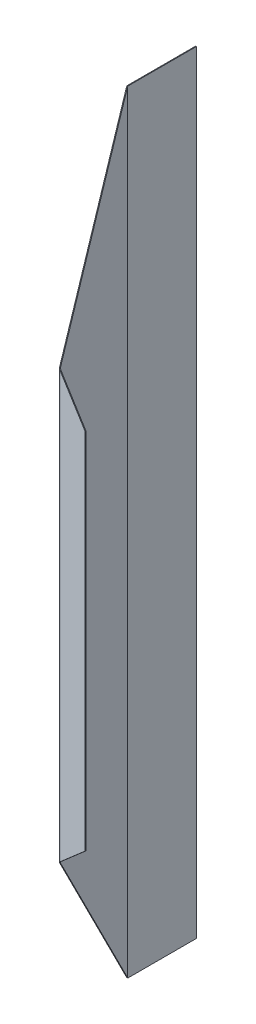
ISO-10303-21;
HEADER;
FILE_DESCRIPTION(('STEP AP214'),'2;1');
FILE_NAME('part.step','',(''),(''),'','','');
FILE_SCHEMA(('AUTOMOTIVE_DESIGN { 1 0 10303 214 1 1 1 1 }'));
ENDSEC;
DATA;
#1=APPLICATION_CONTEXT('core data for automotive mechanical design processes');
#2=APPLICATION_PROTOCOL_DEFINITION('international standard','automotive_design',2000,#1);
#3=PRODUCT_CONTEXT('',#1,'mechanical');
#4=PRODUCT('Part','Part','',(#3));
#5=PRODUCT_RELATED_PRODUCT_CATEGORY('part','',(#4));
#6=PRODUCT_DEFINITION_FORMATION('','',#4);
#7=PRODUCT_DEFINITION_CONTEXT('part definition',#1,'design');
#8=PRODUCT_DEFINITION('design','',#6,#7);
#9=PRODUCT_DEFINITION_SHAPE('','',#8);
#10=(LENGTH_UNIT() NAMED_UNIT(*) SI_UNIT(.MILLI.,.METRE.));
#11=(NAMED_UNIT(*) PLANE_ANGLE_UNIT() SI_UNIT($,.RADIAN.));
#12=(NAMED_UNIT(*) SI_UNIT($,.STERADIAN.) SOLID_ANGLE_UNIT());
#13=UNCERTAINTY_MEASURE_WITH_UNIT(LENGTH_MEASURE(1.E-05),#10,'distance_accuracy_value','');
#14=(GEOMETRIC_REPRESENTATION_CONTEXT(3) GLOBAL_UNCERTAINTY_ASSIGNED_CONTEXT((#13)) GLOBAL_UNIT_ASSIGNED_CONTEXT((#10,
#11,#12)) REPRESENTATION_CONTEXT('',''));
#15=CARTESIAN_POINT('',(0.,0.,0.));
#16=DIRECTION('',(0.,0.,1.));
#17=DIRECTION('',(1.,0.,0.));
#18=AXIS2_PLACEMENT_3D('',#15,#16,#17);
#19=CARTESIAN_POINT('',(41.5605937371392,840.,7.6532480466224));
#20=DIRECTION('',(0.258819045102517,0.,-0.965925826289069));
#21=DIRECTION('',(-0.965925826289069,0.,-0.258819045102517));
#22=AXIS2_PLACEMENT_3D('',#19,#20,#21);
#23=PLANE('',#22);
#24=DIRECTION('',(0.726896130962245,0.658548542068585,0.194771231272638));
#25=VECTOR('',#24,1.);
#26=CARTESIAN_POINT('',(353.700253419294,470.728355092252,91.2908177841798));
#27=LINE('',#26,#25);
#28=CARTESIAN_POINT('',(41.9628570638936,188.302573562308,7.7610341801709));
#29=VERTEX_POINT('',#28);
#30=CARTESIAN_POINT('',(79.7929447639181,222.575625845856,17.8975756289908));
#31=VERTEX_POINT('',#30);
#32=EDGE_CURVE('E217',#29,#31,#27,.T.);
#33=ORIENTED_EDGE('',*,*,#32,.T.);
#34=DIRECTION('',(0.,-1.,0.));
#35=VECTOR('',#34,1.);
#36=CARTESIAN_POINT('',(79.792944763918,840.,17.8975756289908));
#37=LINE('',#36,#35);
#38=CARTESIAN_POINT('',(79.792944763918,617.424374154144,17.8975756289908));
#39=VERTEX_POINT('',#38);
#40=EDGE_CURVE('E11',#39,#31,#37,.T.);
#41=ORIENTED_EDGE('',*,*,#40,.F.);
#42=DIRECTION('',(-0.726896130962245,0.658548542068585,-0.194771231272638));
#43=VECTOR('',#42,1.);
#44=CARTESIAN_POINT('',(-48.4047118963112,733.568038006701,-16.4528829446793));
#45=LINE('',#44,#43);
#46=CARTESIAN_POINT('',(41.9628570638936,651.697426437692,7.7610341801709));
#47=VERTEX_POINT('',#46);
#48=EDGE_CURVE('E225',#39,#47,#45,.T.);
#49=ORIENTED_EDGE('',*,*,#48,.T.);
#50=DIRECTION('',(0.,-1.,0.));
#51=VECTOR('',#50,1.);
#52=CARTESIAN_POINT('',(41.9628570638936,840.,7.7610341801709));
#53=LINE('',#52,#51);
#54=EDGE_CURVE('E177',#47,#29,#53,.T.);
#55=ORIENTED_EDGE('',*,*,#54,.T.);
#56=EDGE_LOOP('',(#33,#41,#49,#55));
#57=FACE_BOUND('',#56,.T.);
#58=ADVANCED_FACE('F34',(#57),#23,.F.);
#59=CARTESIAN_POINT('',(80.,840.,17.1248349679596));
#60=DIRECTION('',(0.965925826289074,0.,0.258819045102499));
#61=DIRECTION('',(0.258819045102499,0.,-0.965925826289074));
#62=AXIS2_PLACEMENT_3D('',#59,#60,#61);
#63=PLANE('',#62);
#64=ORIENTED_EDGE('',*,*,#40,.T.);
#65=DIRECTION('',(-0.258819045102517,0.,0.965925826289069));
#66=VECTOR('',#65,1.);
#67=CARTESIAN_POINT('',(79.7929447639181,222.575625845856,17.8975756289908));
#68=LINE('',#67,#66);
#69=CARTESIAN_POINT('',(80.0000000000001,222.575625845856,17.1248349679596));
#70=VERTEX_POINT('',#69);
#71=EDGE_CURVE('E149',#31,#70,#68,.F.);
#72=ORIENTED_EDGE('',*,*,#71,.T.);
#73=DIRECTION('',(0.,-1.,0.));
#74=VECTOR('',#73,1.);
#75=CARTESIAN_POINT('',(80.,840.,17.1248349679596));
#76=LINE('',#75,#74);
#77=CARTESIAN_POINT('',(80.0000000000001,617.424374154144,17.1248349679596));
#78=VERTEX_POINT('',#77);
#79=EDGE_CURVE('E42',#78,#70,#76,.T.);
#80=ORIENTED_EDGE('',*,*,#79,.F.);
#81=DIRECTION('',(-0.258819045102517,0.,0.965925826289069));
#82=VECTOR('',#81,1.);
#83=CARTESIAN_POINT('',(79.792944763918,617.424374154144,17.8975756289908));
#84=LINE('',#83,#82);
#85=EDGE_CURVE('E208',#39,#78,#84,.F.);
#86=ORIENTED_EDGE('',*,*,#85,.F.);
#87=EDGE_LOOP('',(#64,#72,#80,#86));
#88=FACE_BOUND('',#87,.T.);
#89=ADVANCED_FACE('F207',(#88),#63,.T.);
#90=CARTESIAN_POINT('',(41.7676489732212,840.,6.88050738559115));
#91=DIRECTION('',(0.258819045102517,0.,-0.965925826289069));
#92=DIRECTION('',(-0.96592582628907,0.,-0.258819045102517));
#93=AXIS2_PLACEMENT_3D('',#90,#91,#92);
#94=PLANE('',#93);
#95=ORIENTED_EDGE('',*,*,#79,.T.);
#96=DIRECTION('',(0.726896130962245,0.658548542068585,0.194771231272638));
#97=VECTOR('',#96,1.);
#98=CARTESIAN_POINT('',(353.907308655376,470.728355092252,90.5180771231485));
#99=LINE('',#98,#97);
#100=CARTESIAN_POINT('',(42.1699122999756,188.302573562308,6.98829351913964));
#101=VERTEX_POINT('',#100);
#102=EDGE_CURVE('E202',#101,#70,#99,.T.);
#103=ORIENTED_EDGE('',*,*,#102,.F.);
#104=DIRECTION('',(0.,-1.,0.));
#105=VECTOR('',#104,1.);
#106=CARTESIAN_POINT('',(42.1699122999756,840.,6.98829351913965));
#107=LINE('',#106,#105);
#108=CARTESIAN_POINT('',(42.1699122999756,651.697426437692,6.98829351913965));
#109=VERTEX_POINT('',#108);
#110=EDGE_CURVE('E193',#109,#101,#107,.T.);
#111=ORIENTED_EDGE('',*,*,#110,.F.);
#112=DIRECTION('',(-0.726896130962245,0.658548542068585,-0.194771231272638));
#113=VECTOR('',#112,1.);
#114=CARTESIAN_POINT('',(-48.1976566602291,733.568038006701,-17.2256236057106));
#115=LINE('',#114,#113);
#116=EDGE_CURVE('E203',#78,#109,#115,.T.);
#117=ORIENTED_EDGE('',*,*,#116,.F.);
#118=EDGE_LOOP('',(#95,#103,#111,#117));
#119=FACE_BOUND('',#118,.T.);
#120=ADVANCED_FACE('F200',(#119),#94,.T.);
#121=CARTESIAN_POINT('',(42.3769675360576,840.,6.21555285810838));
#122=DIRECTION('',(0.,-1.,0.));
#123=DIRECTION('',(0.,0.,-1.));
#124=AXIS2_PLACEMENT_3D('',#121,#122,#123);
#125=CYLINDRICAL_SURFACE('',#124,0.8);
#126=ORIENTED_EDGE('',*,*,#110,.T.);
#127=CARTESIAN_POINT('',(42.3769675360576,186.302930806232,6.21555285810838));
#128=DIRECTION('',(-0.325012025135209,0.311422392846851,-0.892963200110202));
#129=DIRECTION('',(-0.106512731436303,-0.950271589196237,-0.292641324505676));
#130=AXIS2_PLACEMENT_3D('',#127,#128,#129);
#131=ELLIPSE('',#130,2.56885830426914,0.8);
#132=CARTESIAN_POINT('',(41.6252134394289,186.302930806232,6.4891689727689));
#133=VERTEX_POINT('',#132);
#134=EDGE_CURVE('E285',#133,#101,#131,.T.);
#135=ORIENTED_EDGE('',*,*,#134,.F.);
#136=DIRECTION('',(0.,-1.,0.));
#137=VECTOR('',#136,1.);
#138=CARTESIAN_POINT('',(41.6252134394289,840.,6.48916897276888));
#139=LINE('',#138,#137);
#140=CARTESIAN_POINT('',(41.6252134394289,653.697069193768,6.48916897276894));
#141=VERTEX_POINT('',#140);
#142=EDGE_CURVE('E190',#141,#133,#139,.T.);
#143=ORIENTED_EDGE('',*,*,#142,.F.);
#144=CARTESIAN_POINT('',(42.3769675360576,653.697069193768,6.21555285810838));
#145=DIRECTION('',(-0.32501202513521,-0.311422392846848,-0.892963200110203));
#146=DIRECTION('',(0.106512731436302,-0.950271589196238,0.292641324505673));
#147=AXIS2_PLACEMENT_3D('',#144,#145,#146);
#148=ELLIPSE('',#147,2.56885830426917,0.8);
#149=EDGE_CURVE('E223',#109,#141,#148,.T.);
#150=ORIENTED_EDGE('',*,*,#149,.F.);
#151=EDGE_LOOP('',(#126,#135,#143,#150));
#152=FACE_BOUND('',#151,.T.);
#153=ADVANCED_FACE('F297',(#152),#125,.F.);
#154=CARTESIAN_POINT('',(0.,840.,-107.87516503204));
#155=DIRECTION('',(0.939692620785908,0.,-0.34202014332567));
#156=DIRECTION('',(-0.34202014332567,0.,-0.939692620785908));
#157=AXIS2_PLACEMENT_3D('',#154,#155,#156);
#158=PLANE('',#157);
#159=ORIENTED_EDGE('',*,*,#142,.T.);
#160=DIRECTION('',(-0.187489312831142,-0.83635901952203,-0.515122653392622));
#161=VECTOR('',#160,1.);
#162=CARTESIAN_POINT('',(-0.138918542133562,0.,-108.256840589696));
#163=LINE('',#162,#161);
#164=CARTESIAN_POINT('',(0.0482459033712412,0.83490983975576,-107.742610501947));
#165=VERTEX_POINT('',#164);
#166=EDGE_CURVE('E148',#133,#165,#163,.T.);
#167=ORIENTED_EDGE('',*,*,#166,.T.);
#168=DIRECTION('',(0.,-1.,0.));
#169=VECTOR('',#168,1.);
#170=CARTESIAN_POINT('',(0.0482459033712802,840.,-107.742610501947));
#171=LINE('',#170,#169);
#172=CARTESIAN_POINT('',(0.0482459033712775,839.165090160244,-107.742610501947));
#173=VERTEX_POINT('',#172);
#174=EDGE_CURVE('E187',#173,#165,#171,.T.);
#175=ORIENTED_EDGE('',*,*,#174,.F.);
#176=DIRECTION('',(0.187489312831142,-0.83635901952203,0.515122653392622));
#177=VECTOR('',#176,1.);
#178=CARTESIAN_POINT('',(-0.138918542133562,840.,-108.256840589696));
#179=LINE('',#178,#177);
#180=EDGE_CURVE('E249',#173,#141,#179,.T.);
#181=ORIENTED_EDGE('',*,*,#180,.T.);
#182=EDGE_LOOP('',(#159,#167,#175,#181));
#183=FACE_BOUND('',#182,.T.);
#184=ADVANCED_FACE('F300',(#183),#158,.T.);
#185=CARTESIAN_POINT('',(0.800000000000002,840.,-108.016226616607));
#186=DIRECTION('',(0.,-1.,0.));
#187=DIRECTION('',(0.,0.,-1.));
#188=AXIS2_PLACEMENT_3D('',#185,#186,#187);
#189=CYLINDRICAL_SURFACE('',#188,0.8);
#190=ORIENTED_EDGE('',*,*,#174,.T.);
#191=CARTESIAN_POINT('',(0.800000000000002,0.834909839755982,-108.016226616607));
#192=DIRECTION('',(-0.286051631728642,0.548182077839243,-0.785920398972588));
#193=DIRECTION('',(-0.187489312831142,-0.83635901952203,-0.515122653392622));
#194=AXIS2_PLACEMENT_3D('',#191,#192,#193);
#195=ELLIPSE('',#194,1.45936912631902,0.8);
#196=CARTESIAN_POINT('',(0.,0.417454919877991,-108.016226616607));
#197=VERTEX_POINT('',#196);
#198=EDGE_CURVE('E157',#197,#165,#195,.T.);
#199=ORIENTED_EDGE('',*,*,#198,.F.);
#200=DIRECTION('',(0.,-1.,0.));
#201=VECTOR('',#200,1.);
#202=CARTESIAN_POINT('',(0.,840.,-108.016226616607));
#203=LINE('',#202,#201);
#204=CARTESIAN_POINT('',(0.,839.582545080122,-108.016226616607));
#205=VERTEX_POINT('',#204);
#206=EDGE_CURVE('E184',#205,#197,#203,.T.);
#207=ORIENTED_EDGE('',*,*,#206,.F.);
#208=CARTESIAN_POINT('',(0.800000000000002,839.165090160244,-108.016226616607));
#209=DIRECTION('',(-0.286051631728642,-0.548182077839243,-0.785920398972588));
#210=DIRECTION('',(0.187489312831142,-0.83635901952203,0.515122653392622));
#211=AXIS2_PLACEMENT_3D('',#208,#209,#210);
#212=ELLIPSE('',#211,1.45936912631902,0.8);
#213=EDGE_CURVE('E234',#173,#205,#212,.T.);
#214=ORIENTED_EDGE('',*,*,#213,.F.);
#215=EDGE_LOOP('',(#190,#199,#207,#214));
#216=FACE_BOUND('',#215,.T.);
#217=ADVANCED_FACE('F310',(#216),#189,.F.);
#218=CARTESIAN_POINT('',(0.,840.,-182.87516503204));
#219=DIRECTION('',(1.,0.,0.));
#220=DIRECTION('',(0.,0.,-1.));
#221=AXIS2_PLACEMENT_3D('',#218,#219,#220);
#222=PLANE('',#221);
#223=ORIENTED_EDGE('',*,*,#206,.T.);
#224=DIRECTION('',(0.,0.820192806896419,0.572087195727517));
#225=VECTOR('',#224,1.);
#226=CARTESIAN_POINT('',(0.,530.092822179721,261.434094032077));
#227=LINE('',#226,#225);
#228=CARTESIAN_POINT('',(0.,0.,-108.30740280402));
#229=VERTEX_POINT('',#228);
#230=EDGE_CURVE('E167',#229,#197,#227,.T.);
#231=ORIENTED_EDGE('',*,*,#230,.F.);
#232=DIRECTION('',(0.,0.,1.));
#233=VECTOR('',#232,1.);
#234=CARTESIAN_POINT('',(0.,0.,-182.87516503204));
#235=LINE('',#234,#233);
#236=CARTESIAN_POINT('',(0.,0.,-182.87516503204));
#237=VERTEX_POINT('',#236);
#238=EDGE_CURVE('E257',#237,#229,#235,.T.);
#239=ORIENTED_EDGE('',*,*,#238,.F.);
#240=DIRECTION('',(0.,-1.,0.));
#241=VECTOR('',#240,1.);
#242=CARTESIAN_POINT('',(0.,840.,-182.87516503204));
#243=LINE('',#242,#241);
#244=CARTESIAN_POINT('',(0.,840.,-182.87516503204));
#245=VERTEX_POINT('',#244);
#246=EDGE_CURVE('E182',#245,#237,#243,.T.);
#247=ORIENTED_EDGE('',*,*,#246,.F.);
#248=DIRECTION('',(0.,0.,1.));
#249=VECTOR('',#248,1.);
#250=CARTESIAN_POINT('',(0.,840.,-182.87516503204));
#251=LINE('',#250,#249);
#252=CARTESIAN_POINT('',(0.,840.,-108.30740280402));
#253=VERTEX_POINT('',#252);
#254=EDGE_CURVE('E260',#245,#253,#251,.T.);
#255=ORIENTED_EDGE('',*,*,#254,.T.);
#256=DIRECTION('',(0.,0.820192806896419,-0.572087195727517));
#257=VECTOR('',#256,1.);
#258=CARTESIAN_POINT('',(0.,874.988819827364,-132.712220364655));
#259=LINE('',#258,#257);
#260=EDGE_CURVE('E57',#205,#253,#259,.T.);
#261=ORIENTED_EDGE('',*,*,#260,.F.);
#262=EDGE_LOOP('',(#223,#231,#239,#247,#255,#261));
#263=FACE_BOUND('',#262,.T.);
#264=ADVANCED_FACE('F313',(#263),#222,.T.);
#265=CARTESIAN_POINT('',(-0.800000000000005,840.,-182.87516503204));
#266=DIRECTION('',(1.,0.,0.));
#267=DIRECTION('',(0.,0.,-1.));
#268=AXIS2_PLACEMENT_3D('',#265,#266,#267);
#269=PLANE('',#268);
#270=DIRECTION('',(0.,0.820192806896419,0.572087195727517));
#271=VECTOR('',#270,1.);
#272=CARTESIAN_POINT('',(-0.799999999999973,530.092822179721,261.434094032077));
#273=LINE('',#272,#271);
#274=CARTESIAN_POINT('',(-0.8,0.,-108.30740280402));
#275=VERTEX_POINT('',#274);
#276=CARTESIAN_POINT('',(-0.799999999999998,0.417454919877991,-108.016226616607));
#277=VERTEX_POINT('',#276);
#278=EDGE_CURVE('E49',#275,#277,#273,.T.);
#279=ORIENTED_EDGE('',*,*,#278,.T.);
#280=DIRECTION('',(0.,-1.,0.));
#281=VECTOR('',#280,1.);
#282=CARTESIAN_POINT('',(-0.799999999999998,840.,-108.016226616607));
#283=LINE('',#282,#281);
#284=CARTESIAN_POINT('',(-0.799999999999998,839.582545080122,-108.016226616607));
#285=VERTEX_POINT('',#284);
#286=EDGE_CURVE('E166',#285,#277,#283,.T.);
#287=ORIENTED_EDGE('',*,*,#286,.F.);
#288=DIRECTION('',(0.,0.820192806896419,-0.572087195727517));
#289=VECTOR('',#288,1.);
#290=CARTESIAN_POINT('',(-0.800000000000002,874.988819827364,-132.712220364655));
#291=LINE('',#290,#289);
#292=CARTESIAN_POINT('',(-0.8,840.,-108.30740280402));
#293=VERTEX_POINT('',#292);
#294=EDGE_CURVE('E240',#285,#293,#291,.T.);
#295=ORIENTED_EDGE('',*,*,#294,.T.);
#296=DIRECTION('',(0.,0.,1.));
#297=VECTOR('',#296,1.);
#298=CARTESIAN_POINT('',(-0.800000000000005,840.,-182.87516503204));
#299=LINE('',#298,#297);
#300=CARTESIAN_POINT('',(-0.800000000000005,840.,-182.87516503204));
#301=VERTEX_POINT('',#300);
#302=EDGE_CURVE('E267',#301,#293,#299,.T.);
#303=ORIENTED_EDGE('',*,*,#302,.F.);
#304=DIRECTION('',(0.,-1.,0.));
#305=VECTOR('',#304,1.);
#306=CARTESIAN_POINT('',(-0.800000000000005,840.,-182.87516503204));
#307=LINE('',#306,#305);
#308=CARTESIAN_POINT('',(-0.800000000000005,0.,-182.87516503204));
#309=VERTEX_POINT('',#308);
#310=EDGE_CURVE('E175',#301,#309,#307,.T.);
#311=ORIENTED_EDGE('',*,*,#310,.T.);
#312=DIRECTION('',(0.,0.,1.));
#313=VECTOR('',#312,1.);
#314=CARTESIAN_POINT('',(-0.800000000000005,0.,-182.87516503204));
#315=LINE('',#314,#313);
#316=EDGE_CURVE('E264',#309,#275,#315,.T.);
#317=ORIENTED_EDGE('',*,*,#316,.T.);
#318=EDGE_LOOP('',(#279,#287,#295,#303,#311,#317));
#319=FACE_BOUND('',#318,.T.);
#320=ADVANCED_FACE('F325',(#319),#269,.F.);
#321=CARTESIAN_POINT('',(0.800000000000002,840.,-108.016226616607));
#322=DIRECTION('',(0.,-1.,0.));
#323=DIRECTION('',(0.,0.,-1.));
#324=AXIS2_PLACEMENT_3D('',#321,#322,#323);
#325=CYLINDRICAL_SURFACE('',#324,1.6);
#326=CARTESIAN_POINT('',(0.800000000000002,0.834909839755982,-108.016226616607));
#327=DIRECTION('',(-0.207441208816461,0.7950701220706,-0.569940037087593));
#328=DIRECTION('',(-0.271929997104545,-0.606517519112714,-0.747121526717094));
#329=AXIS2_PLACEMENT_3D('',#326,#327,#328);
#330=ELLIPSE('',#329,2.0124011148012,1.6);
#331=CARTESIAN_POINT('',(-0.703508193257495,0.83490983975576,-107.468994387286));
#332=VERTEX_POINT('',#331);
#333=EDGE_CURVE('E155',#277,#332,#330,.T.);
#334=ORIENTED_EDGE('',*,*,#333,.T.);
#335=DIRECTION('',(0.,-1.,0.));
#336=VECTOR('',#335,1.);
#337=CARTESIAN_POINT('',(-0.703508193257446,840.,-107.468994387286));
#338=LINE('',#337,#336);
#339=CARTESIAN_POINT('',(-0.703508193257455,839.165090160244,-107.468994387286));
#340=VERTEX_POINT('',#339);
#341=EDGE_CURVE('E164',#340,#332,#338,.T.);
#342=ORIENTED_EDGE('',*,*,#341,.F.);
#343=CARTESIAN_POINT('',(0.800000000000002,839.165090160244,-108.016226616607));
#344=DIRECTION('',(-0.207441208816463,-0.795070122070594,-0.569940037087601));
#345=DIRECTION('',(0.271929997104543,-0.606517519112722,0.747121526717088));
#346=AXIS2_PLACEMENT_3D('',#343,#344,#345);
#347=ELLIPSE('',#346,2.01240111480121,1.6);
#348=EDGE_CURVE('E236',#340,#285,#347,.T.);
#349=ORIENTED_EDGE('',*,*,#348,.T.);
#350=ORIENTED_EDGE('',*,*,#286,.T.);
#351=EDGE_LOOP('',(#334,#342,#349,#350));
#352=FACE_BOUND('',#351,.T.);
#353=ADVANCED_FACE('F162',(#352),#325,.T.);
#354=CARTESIAN_POINT('',(-0.751754096628726,840.,-107.60154891738));
#355=DIRECTION('',(0.939692620785908,0.,-0.34202014332567));
#356=DIRECTION('',(-0.34202014332567,0.,-0.939692620785908));
#357=AXIS2_PLACEMENT_3D('',#354,#355,#356);
#358=PLANE('',#357);
#359=DIRECTION('',(-0.187489312831142,-0.83635901952203,-0.515122653392622));
#360=VECTOR('',#359,1.);
#361=CARTESIAN_POINT('',(-0.890672638762288,0.,-107.983224475035));
#362=LINE('',#361,#360);
#363=CARTESIAN_POINT('',(40.8734593428001,186.302930806232,6.76278508742939));
#364=VERTEX_POINT('',#363);
#365=EDGE_CURVE('E137',#364,#332,#362,.T.);
#366=ORIENTED_EDGE('',*,*,#365,.F.);
#367=DIRECTION('',(0.,-1.,0.));
#368=VECTOR('',#367,1.);
#369=CARTESIAN_POINT('',(40.8734593428001,840.,6.76278508742939));
#370=LINE('',#369,#368);
#371=CARTESIAN_POINT('',(40.8734593428002,653.697069193768,6.76278508742944));
#372=VERTEX_POINT('',#371);
#373=EDGE_CURVE('E173',#372,#364,#370,.T.);
#374=ORIENTED_EDGE('',*,*,#373,.F.);
#375=DIRECTION('',(0.187489312831142,-0.83635901952203,0.515122653392622));
#376=VECTOR('',#375,1.);
#377=CARTESIAN_POINT('',(-0.890672638762288,840.,-107.983224475035));
#378=LINE('',#377,#376);
#379=EDGE_CURVE('E172',#340,#372,#378,.T.);
#380=ORIENTED_EDGE('',*,*,#379,.F.);
#381=ORIENTED_EDGE('',*,*,#341,.T.);
#382=EDGE_LOOP('',(#366,#374,#380,#381));
#383=FACE_BOUND('',#382,.T.);
#384=ADVANCED_FACE('F170',(#383),#358,.F.);
#385=CARTESIAN_POINT('',(42.3769675360576,840.,6.21555285810838));
#386=DIRECTION('',(0.,-1.,0.));
#387=DIRECTION('',(0.,0.,-1.));
#388=AXIS2_PLACEMENT_3D('',#385,#386,#387);
#389=CYLINDRICAL_SURFACE('',#388,1.6);
#390=CARTESIAN_POINT('',(42.3769675360576,186.302930806232,6.21555285810838));
#391=DIRECTION('',(-0.286051631728642,0.548182077839243,-0.785920398972588));
#392=DIRECTION('',(-0.187489312831142,-0.83635901952203,-0.515122653392622));
#393=AXIS2_PLACEMENT_3D('',#390,#391,#392);
#394=ELLIPSE('',#393,2.91873825263804,1.6);
#395=EDGE_CURVE('E282',#364,#29,#394,.T.);
#396=ORIENTED_EDGE('',*,*,#395,.T.);
#397=ORIENTED_EDGE('',*,*,#54,.F.);
#398=CARTESIAN_POINT('',(42.3769675360576,653.697069193768,6.21555285810838));
#399=DIRECTION('',(-0.286051631728642,-0.548182077839243,-0.785920398972588));
#400=DIRECTION('',(0.187489312831142,-0.83635901952203,0.515122653392622));
#401=AXIS2_PLACEMENT_3D('',#398,#399,#400);
#402=ELLIPSE('',#401,2.91873825263804,1.6);
#403=EDGE_CURVE('E221',#47,#372,#402,.T.);
#404=ORIENTED_EDGE('',*,*,#403,.T.);
#405=ORIENTED_EDGE('',*,*,#373,.T.);
#406=EDGE_LOOP('',(#396,#397,#404,#405));
#407=FACE_BOUND('',#406,.T.);
#408=ADVANCED_FACE('F281',(#407),#389,.T.);
#409=CARTESIAN_POINT('',(-0.703508193257446,0.,-107.468994387286));
#410=DIRECTION('',(0.,-1.,0.));
#411=DIRECTION('',(0.,0.,-1.));
#412=AXIS2_PLACEMENT_3D('',#409,#410,#411);
#413=PLANE('',#412);
#414=ORIENTED_EDGE('',*,*,#238,.T.);
#415=DIRECTION('',(1.,0.,0.));
#416=VECTOR('',#415,1.);
#417=CARTESIAN_POINT('',(0.,0.,-108.30740280402));
#418=LINE('',#417,#416);
#419=EDGE_CURVE('E289',#229,#275,#418,.F.);
#420=ORIENTED_EDGE('',*,*,#419,.T.);
#421=ORIENTED_EDGE('',*,*,#316,.F.);
#422=DIRECTION('',(1.,0.,0.));
#423=VECTOR('',#422,1.);
#424=CARTESIAN_POINT('',(-0.800000000000005,0.,-182.87516503204));
#425=LINE('',#424,#423);
#426=EDGE_CURVE('E272',#309,#237,#425,.T.);
#427=ORIENTED_EDGE('',*,*,#426,.T.);
#428=EDGE_LOOP('',(#414,#420,#421,#427));
#429=FACE_BOUND('',#428,.T.);
#430=ADVANCED_FACE('F36',(#429),#413,.T.);
#431=CARTESIAN_POINT('',(42.3769675360576,840.,6.21555285810838));
#432=DIRECTION('',(0.,-1.,0.));
#433=DIRECTION('',(0.,0.,-1.));
#434=AXIS2_PLACEMENT_3D('',#431,#432,#433);
#435=PLANE('',#434);
#436=DIRECTION('',(1.,0.,0.));
#437=VECTOR('',#436,1.);
#438=CARTESIAN_POINT('',(0.,840.,-108.30740280402));
#439=LINE('',#438,#437);
#440=EDGE_CURVE('E245',#253,#293,#439,.F.);
#441=ORIENTED_EDGE('',*,*,#440,.F.);
#442=ORIENTED_EDGE('',*,*,#254,.F.);
#443=DIRECTION('',(1.,0.,0.));
#444=VECTOR('',#443,1.);
#445=CARTESIAN_POINT('',(-0.800000000000005,840.,-182.87516503204));
#446=LINE('',#445,#444);
#447=EDGE_CURVE('E263',#301,#245,#446,.T.);
#448=ORIENTED_EDGE('',*,*,#447,.F.);
#449=ORIENTED_EDGE('',*,*,#302,.T.);
#450=EDGE_LOOP('',(#441,#442,#448,#449));
#451=FACE_BOUND('',#450,.T.);
#452=ADVANCED_FACE('F318',(#451),#435,.F.);
#453=CARTESIAN_POINT('',(-0.800000000000005,840.,-182.87516503204));
#454=DIRECTION('',(0.,0.,-1.));
#455=DIRECTION('',(-1.,0.,0.));
#456=AXIS2_PLACEMENT_3D('',#453,#454,#455);
#457=PLANE('',#456);
#458=ORIENTED_EDGE('',*,*,#426,.F.);
#459=ORIENTED_EDGE('',*,*,#310,.F.);
#460=ORIENTED_EDGE('',*,*,#447,.T.);
#461=ORIENTED_EDGE('',*,*,#246,.T.);
#462=EDGE_LOOP('',(#458,#459,#460,#461));
#463=FACE_BOUND('',#462,.T.);
#464=ADVANCED_FACE('F321',(#463),#457,.T.);
#465=CARTESIAN_POINT('',(-0.890672638762288,840.,-107.983224475035));
#466=DIRECTION('',(0.286051631728642,0.548182077839243,0.785920398972588));
#467=DIRECTION('',(0.187489312831142,-0.83635901952203,0.515122653392622));
#468=AXIS2_PLACEMENT_3D('',#465,#466,#467);
#469=PLANE('',#468);
#470=DIRECTION('',(-0.939692620785908,0.,0.34202014332567));
#471=VECTOR('',#470,1.);
#472=CARTESIAN_POINT('',(-0.703508193257455,839.165090160244,-107.468994387286));
#473=LINE('',#472,#471);
#474=EDGE_CURVE('E254',#340,#173,#473,.F.);
#475=ORIENTED_EDGE('',*,*,#474,.F.);
#476=ORIENTED_EDGE('',*,*,#379,.T.);
#477=DIRECTION('',(-0.939692620785908,0.,0.34202014332567));
#478=VECTOR('',#477,1.);
#479=CARTESIAN_POINT('',(40.8734593428002,653.697069193768,6.76278508742944));
#480=LINE('',#479,#478);
#481=EDGE_CURVE('E252',#372,#141,#480,.F.);
#482=ORIENTED_EDGE('',*,*,#481,.T.);
#483=ORIENTED_EDGE('',*,*,#180,.F.);
#484=EDGE_LOOP('',(#475,#476,#482,#483));
#485=FACE_BOUND('',#484,.T.);
#486=ADVANCED_FACE('F303',(#485),#469,.T.);
#487=CARTESIAN_POINT('',(0.,874.988819827364,-132.712220364655));
#488=DIRECTION('',(0.,-0.572087195727517,-0.820192806896418));
#489=DIRECTION('',(0.,0.820192806896419,-0.572087195727517));
#490=AXIS2_PLACEMENT_3D('',#487,#488,#489);
#491=PLANE('',#490);
#492=ORIENTED_EDGE('',*,*,#260,.T.);
#493=ORIENTED_EDGE('',*,*,#440,.T.);
#494=ORIENTED_EDGE('',*,*,#294,.F.);
#495=DIRECTION('',(1.,0.,0.));
#496=VECTOR('',#495,1.);
#497=CARTESIAN_POINT('',(0.,839.582545080122,-108.016226616607));
#498=LINE('',#497,#496);
#499=EDGE_CURVE('E243',#205,#285,#498,.F.);
#500=ORIENTED_EDGE('',*,*,#499,.F.);
#501=EDGE_LOOP('',(#492,#493,#494,#500));
#502=FACE_BOUND('',#501,.T.);
#503=ADVANCED_FACE('F326',(#502),#491,.F.);
#504=CARTESIAN_POINT('',(1.07361611466054,837.944533628635,-107.264472519978));
#505=CARTESIAN_POINT('',(1.16482148621405,837.944533628635,-107.013887821102));
#506=CARTESIAN_POINT('',(1.25602685776756,837.944533628635,-106.763303122226));
#507=CARTESIAN_POINT('',(1.34723222932107,837.944533628635,-106.51271842335));
#508=CARTESIAN_POINT('',(-0.429892078596914,837.944533628635,-106.717240290657));
#509=CARTESIAN_POINT('',(-0.839856104795887,837.944533628635,-106.284244848674));
#510=CARTESIAN_POINT('',(-1.24982013099486,837.944533628635,-105.851249406691));
#511=CARTESIAN_POINT('',(-1.65978415719383,837.944533628635,-105.418253964708));
#512=CARTESIAN_POINT('',(-0.977124307917987,840.385646691853,-108.220748483915));
#513=CARTESIAN_POINT('',(-1.56949907722398,840.385646691853,-108.288922439684));
#514=CARTESIAN_POINT('',(-2.16187384652998,840.385646691853,-108.357096395453));
#515=CARTESIAN_POINT('',(-2.75424861583598,840.385646691853,-108.425270351223));
#516=CARTESIAN_POINT('',(0.526383885339466,840.385646691853,-108.767980713236));
#517=CARTESIAN_POINT('',(0.435178513785954,840.385646691853,-109.018565412112));
#518=CARTESIAN_POINT('',(0.343973142232442,840.385646691853,-109.269150110988));
#519=CARTESIAN_POINT('',(0.252767770678929,840.385646691853,-109.519734809865));
#520=CARTESIAN_POINT('',(2.02989207859692,840.385646691853,-109.315212942557));
#521=CARTESIAN_POINT('',(2.43985610479589,840.385646691853,-109.74820838454));
#522=CARTESIAN_POINT('',(2.84982013099486,840.385646691853,-110.181203826524));
#523=CARTESIAN_POINT('',(3.25978415719384,840.385646691853,-110.614199268507));
#524=CARTESIAN_POINT('',(2.57712430791799,837.944533628635,-107.8117047493));
#525=CARTESIAN_POINT('',(3.16949907722399,837.944533628635,-107.74353079353));
#526=CARTESIAN_POINT('',(3.76187384652999,837.944533628635,-107.675356837761));
#527=CARTESIAN_POINT('',(4.35424861583598,837.944533628635,-107.607182881992));
#528=CARTESIAN_POINT('',(1.07361611466054,837.944533628635,-107.264472519978));
#529=CARTESIAN_POINT('',(1.16482148621405,837.944533628635,-107.013887821102));
#530=CARTESIAN_POINT('',(1.25602685776756,837.944533628635,-106.763303122226));
#531=CARTESIAN_POINT('',(1.34723222932107,837.944533628635,-106.51271842335));
#532=(BOUNDED_SURFACE() B_SPLINE_SURFACE(3,3,((#504,#505,#506,#507),(#508,#509,#510,#511),(#512,
#513,#514,#515),(#516,#517,#518,#519),(#520,#521,#522,#523),(#524,#525,#526,#527),(#528,#529,
#530,#531)),.UNSPECIFIED.,.T.,.F.,.F.) B_SPLINE_SURFACE_WITH_KNOTS((4,3,4),(4,4),(0.,0.5,1.),
(0.,1.),.UNSPECIFIED.) GEOMETRIC_REPRESENTATION_ITEM() RATIONAL_B_SPLINE_SURFACE(((1.,1.,1.,1.),
(0.333333333333333,0.333333333333333,0.333333333333333,0.333333333333333),(0.333333333333333,
0.333333333333333,0.333333333333333,0.333333333333333),(1.,1.,1.,1.),(0.333333333333333,
0.333333333333333,0.333333333333333,0.333333333333333),(0.333333333333333,0.333333333333333,
0.333333333333333,0.333333333333333),(1.,1.,1.,1.))) REPRESENTATION_ITEM('') SURFACE());
#533=ORIENTED_EDGE('',*,*,#213,.T.);
#534=ORIENTED_EDGE('',*,*,#499,.T.);
#535=ORIENTED_EDGE('',*,*,#348,.F.);
#536=ORIENTED_EDGE('',*,*,#474,.T.);
#537=EDGE_LOOP('',(#533,#534,#535,#536));
#538=FACE_BOUND('',#537,.T.);
#539=ADVANCED_FACE('F307',(#538),#532,.T.);
#540=CARTESIAN_POINT('',(-48.4047118963112,733.568038006701,-16.4528829446793));
#541=DIRECTION('',(-0.63610904464906,-0.75253825001746,-0.170444904811846));
#542=DIRECTION('',(-0.726896130962245,0.658548542068585,-0.194771231272638));
#543=AXIS2_PLACEMENT_3D('',#540,#541,#542);
#544=PLANE('',#543);
#545=DIRECTION('',(-0.258819045102517,0.,0.965925826289069));
#546=VECTOR('',#545,1.);
#547=CARTESIAN_POINT('',(41.9628570638936,651.697426437692,7.7610341801709));
#548=LINE('',#547,#546);
#549=EDGE_CURVE('E231',#47,#109,#548,.F.);
#550=ORIENTED_EDGE('',*,*,#549,.F.);
#551=ORIENTED_EDGE('',*,*,#48,.F.);
#552=ORIENTED_EDGE('',*,*,#85,.T.);
#553=ORIENTED_EDGE('',*,*,#116,.T.);
#554=EDGE_LOOP('',(#550,#551,#552,#553));
#555=FACE_BOUND('',#554,.T.);
#556=ADVANCED_FACE('F333',(#555),#544,.F.);
#557=CARTESIAN_POINT('',(42.6505836507181,651.25595613055,6.96730695473711));
#558=CARTESIAN_POINT('',(42.7417890222716,651.25595613055,7.21789165361335));
#559=CARTESIAN_POINT('',(42.8329943938252,651.25595613055,7.46847635248959));
#560=CARTESIAN_POINT('',(42.9241997653787,651.25595613055,7.71906105136584));
#561=CARTESIAN_POINT('',(41.1470754574607,651.25595613055,7.51453918405818));
#562=CARTESIAN_POINT('',(40.7371114312617,651.25595613055,7.94753462604145));
#563=CARTESIAN_POINT('',(40.3271474050628,651.25595613055,8.38053006802472));
#564=CARTESIAN_POINT('',(39.9171833788638,651.25595613055,8.81352551000798));
#565=CARTESIAN_POINT('',(40.5998432281396,656.138182256985,6.01103099080073));
#566=CARTESIAN_POINT('',(40.0074684588336,656.138182256986,5.94285703503151));
#567=CARTESIAN_POINT('',(39.4150936895276,656.138182256986,5.87468307926229));
#568=CARTESIAN_POINT('',(38.8227189202216,656.138182256985,5.80650912349307));
#569=CARTESIAN_POINT('',(42.1033514213971,656.138182256985,5.46379876147966));
#570=CARTESIAN_POINT('',(42.0121460498435,656.138182256985,5.21321406260341));
#571=CARTESIAN_POINT('',(41.92094067829,656.138182256985,4.96262936372717));
#572=CARTESIAN_POINT('',(41.8297353067365,656.138182256985,4.71204466485093));
#573=CARTESIAN_POINT('',(43.6068596146545,656.138182256985,4.91656653215858));
#574=CARTESIAN_POINT('',(44.0168236408535,656.138182256986,4.48357109017532));
#575=CARTESIAN_POINT('',(44.4267876670525,656.138182256986,4.05057564819205));
#576=CARTESIAN_POINT('',(44.8367516932514,656.138182256985,3.61758020620878));
#577=CARTESIAN_POINT('',(44.1540918439756,651.25595613055,6.42007472541604));
#578=CARTESIAN_POINT('',(44.7464666132816,651.25595613055,6.48824868118526));
#579=CARTESIAN_POINT('',(45.3388413825876,651.25595613055,6.55642263695448));
#580=CARTESIAN_POINT('',(45.9312161518936,651.25595613055,6.62459659272369));
#581=CARTESIAN_POINT('',(42.6505836507181,651.25595613055,6.96730695473711));
#582=CARTESIAN_POINT('',(42.7417890222716,651.25595613055,7.21789165361335));
#583=CARTESIAN_POINT('',(42.8329943938252,651.25595613055,7.46847635248959));
#584=CARTESIAN_POINT('',(42.9241997653787,651.25595613055,7.71906105136584));
#585=(BOUNDED_SURFACE() B_SPLINE_SURFACE(3,3,((#557,#558,#559,#560),(#561,#562,#563,#564),(#565,
#566,#567,#568),(#569,#570,#571,#572),(#573,#574,#575,#576),(#577,#578,#579,#580),(#581,#582,
#583,#584)),.UNSPECIFIED.,.T.,.F.,.F.) B_SPLINE_SURFACE_WITH_KNOTS((4,3,4),(4,4),(0.,0.5,1.),
(0.,1.),.UNSPECIFIED.) GEOMETRIC_REPRESENTATION_ITEM() RATIONAL_B_SPLINE_SURFACE(((1.,1.,1.,1.),
(0.333333333333333,0.333333333333333,0.333333333333333,0.333333333333333),(0.333333333333333,
0.333333333333333,0.333333333333333,0.333333333333333),(1.,1.,1.,1.),(0.333333333333333,
0.333333333333333,0.333333333333333,0.333333333333333),(0.333333333333333,0.333333333333333,
0.333333333333333,0.333333333333333),(1.,1.,1.,1.))) REPRESENTATION_ITEM('') SURFACE());
#586=ORIENTED_EDGE('',*,*,#481,.F.);
#587=ORIENTED_EDGE('',*,*,#403,.F.);
#588=ORIENTED_EDGE('',*,*,#549,.T.);
#589=ORIENTED_EDGE('',*,*,#149,.T.);
#590=EDGE_LOOP('',(#586,#587,#588,#589));
#591=FACE_BOUND('',#590,.T.);
#592=ADVANCED_FACE('F395',(#591),#585,.T.);
#593=CARTESIAN_POINT('',(-0.890672638762288,0.,-107.983224475035));
#594=DIRECTION('',(0.286051631728642,-0.548182077839243,0.785920398972588));
#595=DIRECTION('',(-0.187489312831142,-0.83635901952203,-0.515122653392622));
#596=AXIS2_PLACEMENT_3D('',#593,#594,#595);
#597=PLANE('',#596);
#598=DIRECTION('',(-0.939692620785908,0.,0.34202014332567));
#599=VECTOR('',#598,1.);
#600=CARTESIAN_POINT('',(40.8734593428001,186.302930806232,6.76278508742939));
#601=LINE('',#600,#599);
#602=EDGE_CURVE('E143',#364,#133,#601,.F.);
#603=ORIENTED_EDGE('',*,*,#602,.F.);
#604=ORIENTED_EDGE('',*,*,#365,.T.);
#605=DIRECTION('',(-0.939692620785908,0.,0.34202014332567));
#606=VECTOR('',#605,1.);
#607=CARTESIAN_POINT('',(-0.703508193257492,0.834909839755814,-107.468994387286));
#608=LINE('',#607,#606);
#609=EDGE_CURVE('E140',#332,#165,#608,.F.);
#610=ORIENTED_EDGE('',*,*,#609,.T.);
#611=ORIENTED_EDGE('',*,*,#166,.F.);
#612=EDGE_LOOP('',(#603,#604,#610,#611));
#613=FACE_BOUND('',#612,.T.);
#614=ADVANCED_FACE('F139',(#613),#597,.T.);
#615=CARTESIAN_POINT('',(353.700253419294,470.728355092252,91.2908177841798));
#616=DIRECTION('',(-0.63610904464906,0.75253825001746,-0.170444904811846));
#617=DIRECTION('',(0.726896130962245,0.658548542068585,0.194771231272638));
#618=AXIS2_PLACEMENT_3D('',#615,#616,#617);
#619=PLANE('',#618);
#620=ORIENTED_EDGE('',*,*,#71,.F.);
#621=ORIENTED_EDGE('',*,*,#32,.F.);
#622=DIRECTION('',(-0.258819045102517,0.,0.965925826289069));
#623=VECTOR('',#622,1.);
#624=CARTESIAN_POINT('',(41.9628570638936,188.302573562308,7.7610341801709));
#625=LINE('',#624,#623);
#626=EDGE_CURVE('E212',#29,#101,#625,.F.);
#627=ORIENTED_EDGE('',*,*,#626,.T.);
#628=ORIENTED_EDGE('',*,*,#102,.T.);
#629=EDGE_LOOP('',(#620,#621,#627,#628));
#630=FACE_BOUND('',#629,.T.);
#631=ADVANCED_FACE('F292',(#630),#619,.F.);
#632=CARTESIAN_POINT('',(42.1033514213971,183.861817743015,5.46379876147966));
#633=CARTESIAN_POINT('',(42.0121460498435,183.861817743015,5.21321406260341));
#634=CARTESIAN_POINT('',(41.92094067829,183.861817743015,4.96262936372717));
#635=CARTESIAN_POINT('',(41.8297353067365,183.861817743015,4.71204466485093));
#636=CARTESIAN_POINT('',(40.5998432281396,183.861817743015,6.01103099080073));
#637=CARTESIAN_POINT('',(40.0074684588336,183.861817743015,5.94285703503151));
#638=CARTESIAN_POINT('',(39.4150936895276,183.861817743015,5.87468307926229));
#639=CARTESIAN_POINT('',(38.8227189202216,183.861817743015,5.80650912349307));
#640=CARTESIAN_POINT('',(41.1470754574607,188.74404386945,7.51453918405818));
#641=CARTESIAN_POINT('',(40.7371114312617,188.74404386945,7.94753462604145));
#642=CARTESIAN_POINT('',(40.3271474050628,188.74404386945,8.38053006802472));
#643=CARTESIAN_POINT('',(39.9171833788638,188.74404386945,8.81352551000798));
#644=CARTESIAN_POINT('',(42.6505836507181,188.74404386945,6.96730695473711));
#645=CARTESIAN_POINT('',(42.7417890222716,188.74404386945,7.21789165361335));
#646=CARTESIAN_POINT('',(42.8329943938252,188.74404386945,7.46847635248959));
#647=CARTESIAN_POINT('',(42.9241997653787,188.74404386945,7.71906105136584));
#648=CARTESIAN_POINT('',(44.1540918439756,188.74404386945,6.42007472541604));
#649=CARTESIAN_POINT('',(44.7464666132816,188.74404386945,6.48824868118526));
#650=CARTESIAN_POINT('',(45.3388413825876,188.74404386945,6.55642263695448));
#651=CARTESIAN_POINT('',(45.9312161518936,188.74404386945,6.62459659272369));
#652=CARTESIAN_POINT('',(43.6068596146545,183.861817743015,4.91656653215858));
#653=CARTESIAN_POINT('',(44.0168236408535,183.861817743015,4.48357109017532));
#654=CARTESIAN_POINT('',(44.4267876670525,183.861817743015,4.05057564819205));
#655=CARTESIAN_POINT('',(44.8367516932514,183.861817743015,3.61758020620878));
#656=CARTESIAN_POINT('',(42.1033514213971,183.861817743015,5.46379876147966));
#657=CARTESIAN_POINT('',(42.0121460498435,183.861817743015,5.21321406260341));
#658=CARTESIAN_POINT('',(41.92094067829,183.861817743015,4.96262936372717));
#659=CARTESIAN_POINT('',(41.8297353067365,183.861817743015,4.71204466485093));
#660=(BOUNDED_SURFACE() B_SPLINE_SURFACE(3,3,((#632,#633,#634,#635),(#636,#637,#638,#639),(#640,
#641,#642,#643),(#644,#645,#646,#647),(#648,#649,#650,#651),(#652,#653,#654,#655),(#656,#657,
#658,#659)),.UNSPECIFIED.,.T.,.F.,.F.) B_SPLINE_SURFACE_WITH_KNOTS((4,3,4),(4,4),(0.,0.5,1.),
(0.,1.),.UNSPECIFIED.) GEOMETRIC_REPRESENTATION_ITEM() RATIONAL_B_SPLINE_SURFACE(((1.,1.,1.,1.),
(0.333333333333333,0.333333333333333,0.333333333333333,0.333333333333333),(0.333333333333333,
0.333333333333333,0.333333333333333,0.333333333333333),(1.,1.,1.,1.),(0.333333333333333,
0.333333333333333,0.333333333333333,0.333333333333333),(0.333333333333333,0.333333333333333,
0.333333333333333,0.333333333333333),(1.,1.,1.,1.))) REPRESENTATION_ITEM('') SURFACE());
#661=ORIENTED_EDGE('',*,*,#626,.F.);
#662=ORIENTED_EDGE('',*,*,#395,.F.);
#663=ORIENTED_EDGE('',*,*,#602,.T.);
#664=ORIENTED_EDGE('',*,*,#134,.T.);
#665=EDGE_LOOP('',(#661,#662,#663,#664));
#666=FACE_BOUND('',#665,.T.);
#667=ADVANCED_FACE('F293',(#666),#660,.T.);
#668=CARTESIAN_POINT('',(0.,530.092822179721,261.434094032077));
#669=DIRECTION('',(0.,0.572087195727517,-0.820192806896418));
#670=DIRECTION('',(0.,0.820192806896419,0.572087195727517));
#671=AXIS2_PLACEMENT_3D('',#668,#669,#670);
#672=PLANE('',#671);
#673=ORIENTED_EDGE('',*,*,#230,.T.);
#674=DIRECTION('',(1.,0.,0.));
#675=VECTOR('',#674,1.);
#676=CARTESIAN_POINT('',(0.,0.417454919877991,-108.016226616607));
#677=LINE('',#676,#675);
#678=EDGE_CURVE('E286',#197,#277,#677,.F.);
#679=ORIENTED_EDGE('',*,*,#678,.T.);
#680=ORIENTED_EDGE('',*,*,#278,.F.);
#681=ORIENTED_EDGE('',*,*,#419,.F.);
#682=EDGE_LOOP('',(#673,#679,#680,#681));
#683=FACE_BOUND('',#682,.T.);
#684=ADVANCED_FACE('F372',(#683),#672,.F.);
#685=CARTESIAN_POINT('',(0.526383885339466,-0.385646691852913,-108.767980713236));
#686=CARTESIAN_POINT('',(0.435178513785954,-0.38564669185291,-109.018565412112));
#687=CARTESIAN_POINT('',(0.343973142232442,-0.385646691852906,-109.269150110988));
#688=CARTESIAN_POINT('',(0.25276777067893,-0.385646691852902,-109.519734809865));
#689=CARTESIAN_POINT('',(-0.977124307917986,-0.385646691852913,-108.220748483915));
#690=CARTESIAN_POINT('',(-1.56949907722398,-0.38564669185291,-108.288922439684));
#691=CARTESIAN_POINT('',(-2.16187384652998,-0.385646691852906,-108.357096395453));
#692=CARTESIAN_POINT('',(-2.75424861583598,-0.385646691852902,-108.425270351223));
#693=CARTESIAN_POINT('',(-0.429892078596914,2.05546637136488,-106.717240290657));
#694=CARTESIAN_POINT('',(-0.839856104795887,2.05546637136487,-106.284244848674));
#695=CARTESIAN_POINT('',(-1.24982013099486,2.05546637136487,-105.851249406691));
#696=CARTESIAN_POINT('',(-1.65978415719383,2.05546637136486,-105.418253964708));
#697=CARTESIAN_POINT('',(1.07361611466054,2.05546637136488,-107.264472519978));
#698=CARTESIAN_POINT('',(1.16482148621405,2.05546637136487,-107.013887821102));
#699=CARTESIAN_POINT('',(1.25602685776756,2.05546637136487,-106.763303122226));
#700=CARTESIAN_POINT('',(1.34723222932107,2.05546637136487,-106.51271842335));
#701=CARTESIAN_POINT('',(2.57712430791799,2.05546637136488,-107.8117047493));
#702=CARTESIAN_POINT('',(3.16949907722399,2.05546637136487,-107.74353079353));
#703=CARTESIAN_POINT('',(3.76187384652998,2.05546637136487,-107.675356837761));
#704=CARTESIAN_POINT('',(4.35424861583598,2.05546637136487,-107.607182881992));
#705=CARTESIAN_POINT('',(2.02989207859692,-0.385646691852913,-109.315212942557));
#706=CARTESIAN_POINT('',(2.43985610479589,-0.38564669185291,-109.74820838454));
#707=CARTESIAN_POINT('',(2.84982013099486,-0.385646691852906,-110.181203826524));
#708=CARTESIAN_POINT('',(3.25978415719383,-0.385646691852902,-110.614199268507));
#709=CARTESIAN_POINT('',(0.526383885339466,-0.385646691852913,-108.767980713236));
#710=CARTESIAN_POINT('',(0.435178513785954,-0.38564669185291,-109.018565412112));
#711=CARTESIAN_POINT('',(0.343973142232442,-0.385646691852906,-109.269150110988));
#712=CARTESIAN_POINT('',(0.25276777067893,-0.385646691852902,-109.519734809865));
#713=(BOUNDED_SURFACE() B_SPLINE_SURFACE(3,3,((#685,#686,#687,#688),(#689,#690,#691,#692),(#693,
#694,#695,#696),(#697,#698,#699,#700),(#701,#702,#703,#704),(#705,#706,#707,#708),(#709,#710,
#711,#712)),.UNSPECIFIED.,.T.,.F.,.F.) B_SPLINE_SURFACE_WITH_KNOTS((4,3,4),(4,4),(0.,0.5,1.),
(0.,1.),.UNSPECIFIED.) GEOMETRIC_REPRESENTATION_ITEM() RATIONAL_B_SPLINE_SURFACE(((1.,1.,1.,1.),
(0.333333333333333,0.333333333333333,0.333333333333333,0.333333333333333),(0.333333333333333,
0.333333333333333,0.333333333333333,0.333333333333333),(1.,1.,1.,1.),(0.333333333333333,
0.333333333333333,0.333333333333333,0.333333333333333),(0.333333333333333,0.333333333333333,
0.333333333333333,0.333333333333333),(1.,1.,1.,1.))) REPRESENTATION_ITEM('') SURFACE());
#714=ORIENTED_EDGE('',*,*,#198,.T.);
#715=ORIENTED_EDGE('',*,*,#609,.F.);
#716=ORIENTED_EDGE('',*,*,#333,.F.);
#717=ORIENTED_EDGE('',*,*,#678,.F.);
#718=EDGE_LOOP('',(#714,#715,#716,#717));
#719=FACE_BOUND('',#718,.T.);
#720=ADVANCED_FACE('F153',(#719),#713,.T.);
#721=CLOSED_SHELL('',(#58,#89,#120,#153,#184,#217,#264,#320,#353,#384,#408,#430,#452,#464,#486,
#503,#539,#556,#592,#614,#631,#667,#684,#720));
#722=MANIFOLD_SOLID_BREP('B2',#721);
#723=ADVANCED_BREP_SHAPE_REPRESENTATION('',(#18,#722),#14);
#724=SHAPE_DEFINITION_REPRESENTATION(#9,#723);
ENDSEC;
END-ISO-10303-21;
